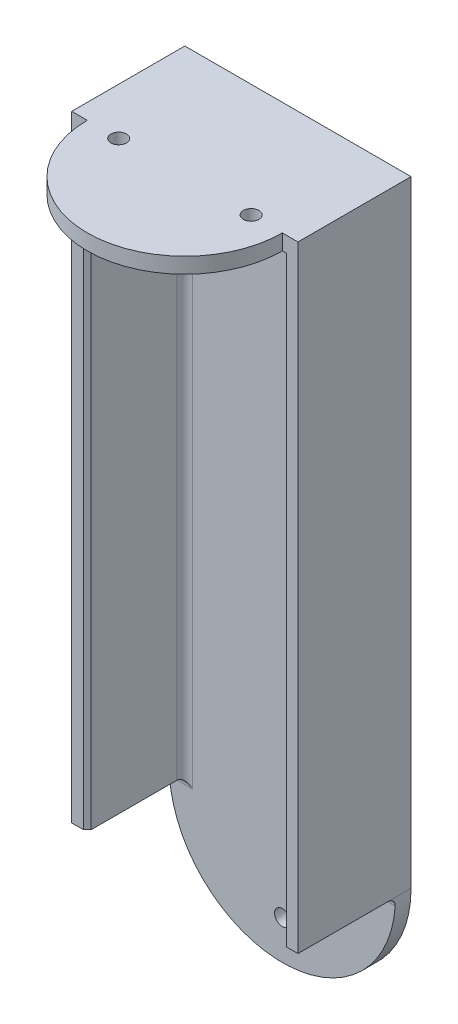
ISO-10303-21;
HEADER;
FILE_DESCRIPTION(('STEP AP214'),'2;1');
FILE_NAME('part.step','',(''),(''),'','','');
FILE_SCHEMA(('AUTOMOTIVE_DESIGN { 1 0 10303 214 1 1 1 1 }'));
ENDSEC;
DATA;
#1=APPLICATION_CONTEXT('core data for automotive mechanical design processes');
#2=APPLICATION_PROTOCOL_DEFINITION('international standard','automotive_design',2000,#1);
#3=PRODUCT_CONTEXT('',#1,'mechanical');
#4=PRODUCT('Part','Part','',(#3));
#5=PRODUCT_RELATED_PRODUCT_CATEGORY('part','',(#4));
#6=PRODUCT_DEFINITION_FORMATION('','',#4);
#7=PRODUCT_DEFINITION_CONTEXT('part definition',#1,'design');
#8=PRODUCT_DEFINITION('design','',#6,#7);
#9=PRODUCT_DEFINITION_SHAPE('','',#8);
#10=(LENGTH_UNIT() NAMED_UNIT(*) SI_UNIT(.MILLI.,.METRE.));
#11=(NAMED_UNIT(*) PLANE_ANGLE_UNIT() SI_UNIT($,.RADIAN.));
#12=(NAMED_UNIT(*) SI_UNIT($,.STERADIAN.) SOLID_ANGLE_UNIT());
#13=UNCERTAINTY_MEASURE_WITH_UNIT(LENGTH_MEASURE(1.E-05),#10,'distance_accuracy_value','');
#14=(GEOMETRIC_REPRESENTATION_CONTEXT(3) GLOBAL_UNCERTAINTY_ASSIGNED_CONTEXT((#13)) GLOBAL_UNIT_ASSIGNED_CONTEXT((#10,
#11,#12)) REPRESENTATION_CONTEXT('',''));
#15=CARTESIAN_POINT('',(0.,0.,0.));
#16=DIRECTION('',(0.,0.,1.));
#17=DIRECTION('',(1.,0.,0.));
#18=AXIS2_PLACEMENT_3D('',#15,#16,#17);
#19=CARTESIAN_POINT('',(0.,-39.5,0.));
#20=DIRECTION('',(0.,0.,1.));
#21=DIRECTION('',(1.,0.,0.));
#22=AXIS2_PLACEMENT_3D('',#19,#20,#21);
#23=PLANE('',#22);
#24=CARTESIAN_POINT('',(0.,-49.,0.));
#25=DIRECTION('',(0.,0.,1.));
#26=DIRECTION('',(1.,0.,0.));
#27=AXIS2_PLACEMENT_3D('',#24,#25,#26);
#28=CIRCLE('',#27,1.);
#29=CARTESIAN_POINT('',(1.,-49.,0.));
#30=VERTEX_POINT('',#29);
#31=EDGE_CURVE('E249',#30,#30,#28,.T.);
#32=ORIENTED_EDGE('',*,*,#31,.F.);
#33=EDGE_LOOP('',(#32));
#34=FACE_BOUND('',#33,.T.);
#35=CARTESIAN_POINT('',(0.,34.5,0.));
#36=DIRECTION('',(0.,0.,1.));
#37=DIRECTION('',(1.,0.,0.));
#38=AXIS2_PLACEMENT_3D('',#35,#36,#37);
#39=CIRCLE('',#38,1.);
#40=CARTESIAN_POINT('',(1.,34.5,0.));
#41=VERTEX_POINT('',#40);
#42=EDGE_CURVE('E263',#41,#41,#39,.T.);
#43=ORIENTED_EDGE('',*,*,#42,.F.);
#44=EDGE_LOOP('',(#43));
#45=FACE_BOUND('',#44,.T.);
#46=CARTESIAN_POINT('',(0.,-39.5,0.));
#47=DIRECTION('',(0.,0.,1.));
#48=DIRECTION('',(1.,0.,0.));
#49=AXIS2_PLACEMENT_3D('',#46,#47,#48);
#50=CIRCLE('',#49,14.5);
#51=CARTESIAN_POINT('',(-14.4654761414894,-40.5,0.));
#52=VERTEX_POINT('',#51);
#53=CARTESIAN_POINT('',(14.4654761414894,-40.5,0.));
#54=VERTEX_POINT('',#53);
#55=EDGE_CURVE('E268',#52,#54,#50,.T.);
#56=ORIENTED_EDGE('',*,*,#55,.T.);
#57=DIRECTION('',(1.,0.,0.));
#58=VECTOR('',#57,1.);
#59=CARTESIAN_POINT('',(12.5,-40.5,0.));
#60=LINE('',#59,#58);
#61=CARTESIAN_POINT('',(11.5,-40.5,0.));
#62=VERTEX_POINT('',#61);
#63=EDGE_CURVE('E146',#54,#62,#60,.F.);
#64=ORIENTED_EDGE('',*,*,#63,.T.);
#65=DIRECTION('',(0.,1.,0.));
#66=VECTOR('',#65,1.);
#67=CARTESIAN_POINT('',(11.5,37.5,0.));
#68=LINE('',#67,#66);
#69=CARTESIAN_POINT('',(11.5,36.5,0.));
#70=VERTEX_POINT('',#69);
#71=EDGE_CURVE('E148',#62,#70,#68,.T.);
#72=ORIENTED_EDGE('',*,*,#71,.T.);
#73=DIRECTION('',(1.,0.,0.));
#74=VECTOR('',#73,1.);
#75=CARTESIAN_POINT('',(0.,36.5,0.));
#76=LINE('',#75,#74);
#77=CARTESIAN_POINT('',(-11.5,36.5,0.));
#78=VERTEX_POINT('',#77);
#79=EDGE_CURVE('E136',#70,#78,#76,.F.);
#80=ORIENTED_EDGE('',*,*,#79,.T.);
#81=DIRECTION('',(0.,-1.,0.));
#82=VECTOR('',#81,1.);
#83=CARTESIAN_POINT('',(-11.5,-39.5,0.));
#84=LINE('',#83,#82);
#85=CARTESIAN_POINT('',(-11.5,-40.5,0.));
#86=VERTEX_POINT('',#85);
#87=EDGE_CURVE('E325',#78,#86,#84,.T.);
#88=ORIENTED_EDGE('',*,*,#87,.T.);
#89=DIRECTION('',(-1.,0.,0.));
#90=VECTOR('',#89,1.);
#91=CARTESIAN_POINT('',(-14.5,-40.5,0.));
#92=LINE('',#91,#90);
#93=EDGE_CURVE('E323',#86,#52,#92,.T.);
#94=ORIENTED_EDGE('',*,*,#93,.T.);
#95=EDGE_LOOP('',(#56,#64,#72,#80,#88,#94));
#96=FACE_BOUND('',#95,.T.);
#97=ADVANCED_FACE('F35',(#34,#45,#96),#23,.T.);
#98=CARTESIAN_POINT('',(-12.5,0.,0.));
#99=DIRECTION('',(-1.,0.,0.));
#100=DIRECTION('',(0.,0.,1.));
#101=AXIS2_PLACEMENT_3D('',#98,#99,#100);
#102=PLANE('',#101);
#103=DIRECTION('',(0.,0.,1.));
#104=VECTOR('',#103,1.);
#105=CARTESIAN_POINT('',(-12.5,-39.5,0.));
#106=LINE('',#105,#104);
#107=CARTESIAN_POINT('',(-12.5,-39.5,1.));
#108=VERTEX_POINT('',#107);
#109=CARTESIAN_POINT('',(-12.5,-39.5,12.));
#110=VERTEX_POINT('',#109);
#111=EDGE_CURVE('E256',#108,#110,#106,.T.);
#112=ORIENTED_EDGE('',*,*,#111,.F.);
#113=DIRECTION('',(0.,-1.,0.));
#114=VECTOR('',#113,1.);
#115=CARTESIAN_POINT('',(-12.5,0.,1.));
#116=LINE('',#115,#114);
#117=CARTESIAN_POINT('',(-12.5,37.5,1.));
#118=VERTEX_POINT('',#117);
#119=EDGE_CURVE('E124',#108,#118,#116,.F.);
#120=ORIENTED_EDGE('',*,*,#119,.T.);
#121=DIRECTION('',(0.,0.,1.));
#122=VECTOR('',#121,1.);
#123=CARTESIAN_POINT('',(-12.5,37.5,0.));
#124=LINE('',#123,#122);
#125=CARTESIAN_POINT('',(-12.5,37.5,12.));
#126=VERTEX_POINT('',#125);
#127=EDGE_CURVE('E119',#118,#126,#124,.T.);
#128=ORIENTED_EDGE('',*,*,#127,.T.);
#129=DIRECTION('',(0.,-1.,0.));
#130=VECTOR('',#129,1.);
#131=CARTESIAN_POINT('',(-12.5,-39.5,12.));
#132=LINE('',#131,#130);
#133=EDGE_CURVE('E310',#126,#110,#132,.T.);
#134=ORIENTED_EDGE('',*,*,#133,.T.);
#135=EDGE_LOOP('',(#112,#120,#128,#134));
#136=FACE_BOUND('',#135,.T.);
#137=ADVANCED_FACE('F202',(#136),#102,.F.);
#138=CARTESIAN_POINT('',(12.5,0.,0.));
#139=DIRECTION('',(-1.,0.,0.));
#140=DIRECTION('',(0.,0.,1.));
#141=AXIS2_PLACEMENT_3D('',#138,#139,#140);
#142=PLANE('',#141);
#143=DIRECTION('',(0.,0.,1.));
#144=VECTOR('',#143,1.);
#145=CARTESIAN_POINT('',(12.5,37.5,0.));
#146=LINE('',#145,#144);
#147=CARTESIAN_POINT('',(12.5,37.5,1.));
#148=VERTEX_POINT('',#147);
#149=CARTESIAN_POINT('',(12.5,37.5,12.));
#150=VERTEX_POINT('',#149);
#151=EDGE_CURVE('E115',#148,#150,#146,.T.);
#152=ORIENTED_EDGE('',*,*,#151,.F.);
#153=DIRECTION('',(0.,1.,0.));
#154=VECTOR('',#153,1.);
#155=CARTESIAN_POINT('',(12.5,-39.5,1.));
#156=LINE('',#155,#154);
#157=CARTESIAN_POINT('',(12.5,-39.5,1.));
#158=VERTEX_POINT('',#157);
#159=EDGE_CURVE('E87',#148,#158,#156,.F.);
#160=ORIENTED_EDGE('',*,*,#159,.T.);
#161=DIRECTION('',(0.,0.,-1.));
#162=VECTOR('',#161,1.);
#163=CARTESIAN_POINT('',(12.5,-39.5,0.));
#164=LINE('',#163,#162);
#165=CARTESIAN_POINT('',(12.5,-39.5,12.));
#166=VERTEX_POINT('',#165);
#167=EDGE_CURVE('E349',#166,#158,#164,.T.);
#168=ORIENTED_EDGE('',*,*,#167,.F.);
#169=DIRECTION('',(0.,1.,0.));
#170=VECTOR('',#169,1.);
#171=CARTESIAN_POINT('',(12.5,0.,12.));
#172=LINE('',#171,#170);
#173=EDGE_CURVE('E128',#166,#150,#172,.T.);
#174=ORIENTED_EDGE('',*,*,#173,.T.);
#175=EDGE_LOOP('',(#152,#160,#168,#174));
#176=FACE_BOUND('',#175,.T.);
#177=ADVANCED_FACE('F126',(#176),#142,.T.);
#178=CARTESIAN_POINT('',(-14.5,-39.5,-2.));
#179=DIRECTION('',(-1.,0.,0.));
#180=DIRECTION('',(0.,0.,1.));
#181=AXIS2_PLACEMENT_3D('',#178,#179,#180);
#182=PLANE('',#181);
#183=DIRECTION('',(0.,0.,1.));
#184=VECTOR('',#183,1.);
#185=CARTESIAN_POINT('',(-14.5,-39.5,-2.));
#186=LINE('',#185,#184);
#187=CARTESIAN_POINT('',(-14.5,-39.5,-2.));
#188=VERTEX_POINT('',#187);
#189=CARTESIAN_POINT('',(-14.5,-39.5,1.));
#190=VERTEX_POINT('',#189);
#191=EDGE_CURVE('E53',#188,#190,#186,.T.);
#192=ORIENTED_EDGE('',*,*,#191,.T.);
#193=DIRECTION('',(0.,0.,1.));
#194=VECTOR('',#193,1.);
#195=CARTESIAN_POINT('',(-14.5,-39.5,0.));
#196=LINE('',#195,#194);
#197=CARTESIAN_POINT('',(-14.5,-39.5,12.5));
#198=VERTEX_POINT('',#197);
#199=EDGE_CURVE('E360',#190,#198,#196,.T.);
#200=ORIENTED_EDGE('',*,*,#199,.T.);
#201=DIRECTION('',(0.,1.,0.));
#202=VECTOR('',#201,1.);
#203=CARTESIAN_POINT('',(-14.5,39.5,12.5));
#204=LINE('',#203,#202);
#205=CARTESIAN_POINT('',(-14.5,39.5,12.5));
#206=VERTEX_POINT('',#205);
#207=EDGE_CURVE('E259',#198,#206,#204,.T.);
#208=ORIENTED_EDGE('',*,*,#207,.T.);
#209=DIRECTION('',(0.,0.,1.));
#210=VECTOR('',#209,1.);
#211=CARTESIAN_POINT('',(-14.5,39.5,-2.));
#212=LINE('',#211,#210);
#213=CARTESIAN_POINT('',(-14.5,39.5,-2.));
#214=VERTEX_POINT('',#213);
#215=EDGE_CURVE('E242',#214,#206,#212,.T.);
#216=ORIENTED_EDGE('',*,*,#215,.F.);
#217=DIRECTION('',(0.,-1.,0.));
#218=VECTOR('',#217,1.);
#219=CARTESIAN_POINT('',(-14.5,-39.5,-2.));
#220=LINE('',#219,#218);
#221=EDGE_CURVE('E271',#214,#188,#220,.T.);
#222=ORIENTED_EDGE('',*,*,#221,.T.);
#223=EDGE_LOOP('',(#192,#200,#208,#216,#222));
#224=FACE_BOUND('',#223,.T.);
#225=ADVANCED_FACE('F177',(#224),#182,.T.);
#226=CARTESIAN_POINT('',(14.5,39.5,-2.));
#227=DIRECTION('',(0.,1.,0.));
#228=DIRECTION('',(0.,0.,1.));
#229=AXIS2_PLACEMENT_3D('',#226,#227,#228);
#230=PLANE('',#229);
#231=CARTESIAN_POINT('',(-8.47445336325647,39.5,12.5000000000001));
#232=DIRECTION('',(0.,1.,0.));
#233=DIRECTION('',(0.,0.,1.));
#234=AXIS2_PLACEMENT_3D('',#231,#232,#233);
#235=CIRCLE('',#234,1.);
#236=CARTESIAN_POINT('',(-8.47445336325647,39.5,13.5000000000001));
#237=VERTEX_POINT('',#236);
#238=EDGE_CURVE('E223',#237,#237,#235,.T.);
#239=ORIENTED_EDGE('',*,*,#238,.F.);
#240=EDGE_LOOP('',(#239));
#241=FACE_BOUND('',#240,.T.);
#242=CARTESIAN_POINT('',(8.5,39.5,12.5));
#243=DIRECTION('',(0.,1.,0.));
#244=DIRECTION('',(0.,0.,1.));
#245=AXIS2_PLACEMENT_3D('',#242,#243,#244);
#246=CIRCLE('',#245,0.999999999999999);
#247=CARTESIAN_POINT('',(8.5,39.5,13.5));
#248=VERTEX_POINT('',#247);
#249=EDGE_CURVE('E227',#248,#248,#246,.T.);
#250=ORIENTED_EDGE('',*,*,#249,.F.);
#251=EDGE_LOOP('',(#250));
#252=FACE_BOUND('',#251,.T.);
#253=DIRECTION('',(-1.,0.,0.));
#254=VECTOR('',#253,1.);
#255=CARTESIAN_POINT('',(-12.5,39.5,12.5));
#256=LINE('',#255,#254);
#257=CARTESIAN_POINT('',(-12.5,39.5,12.5));
#258=VERTEX_POINT('',#257);
#259=EDGE_CURVE('E233',#258,#206,#256,.T.);
#260=ORIENTED_EDGE('',*,*,#259,.F.);
#261=CARTESIAN_POINT('',(0.,39.5,12.5));
#262=DIRECTION('',(0.,1.,0.));
#263=DIRECTION('',(0.,0.,1.));
#264=AXIS2_PLACEMENT_3D('',#261,#262,#263);
#265=CIRCLE('',#264,12.5);
#266=CARTESIAN_POINT('',(12.5,39.5,12.5));
#267=VERTEX_POINT('',#266);
#268=EDGE_CURVE('E237',#258,#267,#265,.T.);
#269=ORIENTED_EDGE('',*,*,#268,.T.);
#270=DIRECTION('',(1.,0.,0.));
#271=VECTOR('',#270,1.);
#272=CARTESIAN_POINT('',(12.5,39.5,12.5));
#273=LINE('',#272,#271);
#274=CARTESIAN_POINT('',(14.5,39.5,12.5));
#275=VERTEX_POINT('',#274);
#276=EDGE_CURVE('E352',#267,#275,#273,.T.);
#277=ORIENTED_EDGE('',*,*,#276,.T.);
#278=DIRECTION('',(0.,0.,1.));
#279=VECTOR('',#278,1.);
#280=CARTESIAN_POINT('',(14.5,39.5,-2.));
#281=LINE('',#280,#279);
#282=CARTESIAN_POINT('',(14.5,39.5,-2.));
#283=VERTEX_POINT('',#282);
#284=EDGE_CURVE('E284',#283,#275,#281,.T.);
#285=ORIENTED_EDGE('',*,*,#284,.F.);
#286=DIRECTION('',(-1.,0.,0.));
#287=VECTOR('',#286,1.);
#288=CARTESIAN_POINT('',(14.5,39.5,-2.));
#289=LINE('',#288,#287);
#290=EDGE_CURVE('E278',#283,#214,#289,.T.);
#291=ORIENTED_EDGE('',*,*,#290,.T.);
#292=ORIENTED_EDGE('',*,*,#215,.T.);
#293=EDGE_LOOP('',(#260,#269,#277,#285,#291,#292));
#294=FACE_BOUND('',#293,.T.);
#295=ADVANCED_FACE('F181',(#241,#252,#294),#230,.T.);
#296=CARTESIAN_POINT('',(14.5,-39.5,-2.));
#297=DIRECTION('',(1.,0.,0.));
#298=DIRECTION('',(0.,0.,-1.));
#299=AXIS2_PLACEMENT_3D('',#296,#297,#298);
#300=PLANE('',#299);
#301=ORIENTED_EDGE('',*,*,#284,.T.);
#302=DIRECTION('',(0.,-1.,0.));
#303=VECTOR('',#302,1.);
#304=CARTESIAN_POINT('',(14.5,39.5,12.5));
#305=LINE('',#304,#303);
#306=CARTESIAN_POINT('',(14.5,-39.5,12.5));
#307=VERTEX_POINT('',#306);
#308=EDGE_CURVE('E345',#275,#307,#305,.T.);
#309=ORIENTED_EDGE('',*,*,#308,.T.);
#310=DIRECTION('',(0.,0.,-1.));
#311=VECTOR('',#310,1.);
#312=CARTESIAN_POINT('',(14.5,-39.5,0.));
#313=LINE('',#312,#311);
#314=CARTESIAN_POINT('',(14.5,-39.5,1.));
#315=VERTEX_POINT('',#314);
#316=EDGE_CURVE('E350',#307,#315,#313,.T.);
#317=ORIENTED_EDGE('',*,*,#316,.T.);
#318=DIRECTION('',(0.,0.,1.));
#319=VECTOR('',#318,1.);
#320=CARTESIAN_POINT('',(14.5,-39.5,-2.));
#321=LINE('',#320,#319);
#322=CARTESIAN_POINT('',(14.5,-39.5,-2.));
#323=VERTEX_POINT('',#322);
#324=EDGE_CURVE('E75',#323,#315,#321,.T.);
#325=ORIENTED_EDGE('',*,*,#324,.F.);
#326=DIRECTION('',(0.,1.,0.));
#327=VECTOR('',#326,1.);
#328=CARTESIAN_POINT('',(14.5,-39.5,-2.));
#329=LINE('',#328,#327);
#330=EDGE_CURVE('E275',#323,#283,#329,.T.);
#331=ORIENTED_EDGE('',*,*,#330,.T.);
#332=EDGE_LOOP('',(#301,#309,#317,#325,#331));
#333=FACE_BOUND('',#332,.T.);
#334=ADVANCED_FACE('F175',(#333),#300,.T.);
#335=CARTESIAN_POINT('',(0.,-39.5,-2.));
#336=DIRECTION('',(0.,0.,1.));
#337=DIRECTION('',(1.,0.,0.));
#338=AXIS2_PLACEMENT_3D('',#335,#336,#337);
#339=CYLINDRICAL_SURFACE('',#338,14.5);
#340=ORIENTED_EDGE('',*,*,#55,.F.);
#341=CARTESIAN_POINT('',(-14.4654761414894,-40.5,0.));
#342=CARTESIAN_POINT('',(-14.4674164791853,-40.4719386796734,1.84003181222671E-07));
#343=CARTESIAN_POINT('',(-14.4692732370801,-40.4438848824766,0.00118191398940414));
#344=CARTESIAN_POINT('',(-14.4728124350816,-40.3879658061393,0.00589916918851215));
#345=CARTESIAN_POINT('',(-14.474494880839,-40.3601005209152,0.00943461807218605));
#346=CARTESIAN_POINT('',(-14.4792650427977,-40.2771344850049,0.023542478609587));
#347=CARTESIAN_POINT('',(-14.4820819080417,-40.2225716264139,0.0376164769448302));
#348=CARTESIAN_POINT('',(-14.4869836822029,-40.1165470533677,0.0747299832331384));
#349=CARTESIAN_POINT('',(-14.4890681833228,-40.0650870798388,0.0977744711574841));
#350=CARTESIAN_POINT('',(-14.4925693519238,-39.966749048083,0.152180181513734));
#351=CARTESIAN_POINT('',(-14.4939861530983,-39.9198700740952,0.183539737055564));
#352=CARTESIAN_POINT('',(-14.4962631922019,-39.8320892923725,0.253644029411876));
#353=CARTESIAN_POINT('',(-14.4971241261777,-39.7911800593403,0.292379451247894));
#354=CARTESIAN_POINT('',(-14.4984331089142,-39.7164227662041,0.376173714087721));
#355=CARTESIAN_POINT('',(-14.4988810730216,-39.6825761549423,0.421233849392498));
#356=CARTESIAN_POINT('',(-14.4995100373056,-39.6228956409267,0.516422435475909));
#357=CARTESIAN_POINT('',(-14.499690840859,-39.5970676507045,0.566554590167599));
#358=CARTESIAN_POINT('',(-14.4999146401083,-39.5542003162398,0.670431730824274));
#359=CARTESIAN_POINT('',(-14.4999577149848,-39.5371559270248,0.724174622819376));
#360=CARTESIAN_POINT('',(-14.4999929166407,-39.5165196051831,0.815197776418919));
#361=CARTESIAN_POINT('',(-14.4999973347025,-39.51032868207,0.851909989001435));
#362=CARTESIAN_POINT('',(-14.5000000170038,-39.5020692902672,0.925743036296814));
#363=CARTESIAN_POINT('',(-14.499998289855,-39.4999950589587,0.962863226569514));
#364=CARTESIAN_POINT('',(-14.5,-39.5,1.));
#365=B_SPLINE_CURVE_WITH_KNOTS('',3,(#341,#342,#343,#344,#345,#346,#347,#348,#349,#350,#351,
#352,#353,#354,#355,#356,#357,#358,#359,#360,#361,#362,#363,#364),.UNSPECIFIED.,.F.,.F.,(4,2,2,
2,2,2,2,2,2,2,2,4),(0.,0.0843335524691576,0.168664370202231,0.337053083432004,0.505535411354778,
0.673983989766038,0.84222122876691,1.0104929464768,1.17888844629415,1.34718711792118,
1.45866345890462,1.56998364293882),.UNSPECIFIED.);
#366=EDGE_CURVE('E11',#52,#190,#365,.T.);
#367=ORIENTED_EDGE('',*,*,#366,.T.);
#368=ORIENTED_EDGE('',*,*,#191,.F.);
#369=CARTESIAN_POINT('',(0.,-39.5,-2.));
#370=DIRECTION('',(0.,0.,1.));
#371=DIRECTION('',(1.,0.,0.));
#372=AXIS2_PLACEMENT_3D('',#369,#370,#371);
#373=CIRCLE('',#372,14.5);
#374=EDGE_CURVE('E273',#188,#323,#373,.T.);
#375=ORIENTED_EDGE('',*,*,#374,.T.);
#376=ORIENTED_EDGE('',*,*,#324,.T.);
#377=CARTESIAN_POINT('',(14.5,-39.5,1.));
#378=CARTESIAN_POINT('',(14.4999995283151,-39.5000001872904,0.971866571564379));
#379=CARTESIAN_POINT('',(14.5000000530088,-39.5011879795094,0.943746620853791));
#380=CARTESIAN_POINT('',(14.4999990743133,-39.5059265678941,0.887707917176574));
#381=CARTESIAN_POINT('',(14.4999975710211,-39.5094772511853,0.859789154663642));
#382=CARTESIAN_POINT('',(14.4999840037029,-39.5236399910151,0.776682961505174));
#383=CARTESIAN_POINT('',(14.4999629070439,-39.5377628305202,0.722052165421193));
#384=CARTESIAN_POINT('',(14.4998179417489,-39.5749789894795,0.615938342946781));
#385=CARTESIAN_POINT('',(14.499694023477,-39.5980766385385,0.564456849730269));
#386=CARTESIAN_POINT('',(14.4992226683436,-39.6525840126122,0.466104218025147));
#387=CARTESIAN_POINT('',(14.4988752706745,-39.6839922795951,0.419232272804681));
#388=CARTESIAN_POINT('',(14.4978136666883,-39.754220763836,0.331439306768043));
#389=CARTESIAN_POINT('',(14.4970995369515,-39.7930394326041,0.290517045837405));
#390=CARTESIAN_POINT('',(14.495158963071,-39.876995690902,0.21576496634361));
#391=CARTESIAN_POINT('',(14.4939324290019,-39.922134388653,0.181936394267359));
#392=CARTESIAN_POINT('',(14.4908442845553,-40.0173968076933,0.122361416057955));
#393=CARTESIAN_POINT('',(14.4889830845207,-40.0675172932142,0.0966098083720392));
#394=CARTESIAN_POINT('',(14.484543777681,-40.1713294213062,0.0538914270383299));
#395=CARTESIAN_POINT('',(14.4819660683055,-40.2250190716277,0.0369197982483215));
#396=CARTESIAN_POINT('',(14.4770745305932,-40.3158600117236,0.0163995899088281));
#397=CARTESIAN_POINT('',(14.4749668028222,-40.3524567922007,0.0102518713847202));
#398=CARTESIAN_POINT('',(14.4704468194944,-40.4260341964225,0.00205253938310625));
#399=CARTESIAN_POINT('',(14.4680350067807,-40.4630141916209,-4.95911299779774E-06));
#400=CARTESIAN_POINT('',(14.4654761414894,-40.5,0.));
#401=B_SPLINE_CURVE_WITH_KNOTS('',3,(#377,#378,#379,#380,#381,#382,#383,#384,#385,#386,#387,
#388,#389,#390,#391,#392,#393,#394,#395,#396,#397,#398,#399,#400),.UNSPECIFIED.,.F.,.F.,(4,2,2,
2,2,2,2,2,2,2,2,4),(0.,0.0843484473991786,0.168692865788987,0.337104891443355,0.505598263073496,
0.674062093460334,0.842490759819773,1.0109489973276,1.1792985241724,1.3475548575206,
1.45884908937221,1.56998307457883),.UNSPECIFIED.);
#402=EDGE_CURVE('E45',#315,#54,#401,.T.);
#403=ORIENTED_EDGE('',*,*,#402,.T.);
#404=EDGE_LOOP('',(#340,#367,#368,#375,#376,#403));
#405=FACE_BOUND('',#404,.T.);
#406=ADVANCED_FACE('F169',(#405),#339,.T.);
#407=CARTESIAN_POINT('',(0.,-39.5,-2.));
#408=DIRECTION('',(0.,0.,1.));
#409=DIRECTION('',(1.,0.,0.));
#410=AXIS2_PLACEMENT_3D('',#407,#408,#409);
#411=PLANE('',#410);
#412=CARTESIAN_POINT('',(0.,-49.,-2.));
#413=DIRECTION('',(0.,0.,1.));
#414=DIRECTION('',(1.,0.,0.));
#415=AXIS2_PLACEMENT_3D('',#412,#413,#414);
#416=CIRCLE('',#415,1.);
#417=CARTESIAN_POINT('',(1.,-49.,-2.));
#418=VERTEX_POINT('',#417);
#419=EDGE_CURVE('E253',#418,#418,#416,.T.);
#420=ORIENTED_EDGE('',*,*,#419,.T.);
#421=EDGE_LOOP('',(#420));
#422=FACE_BOUND('',#421,.T.);
#423=CARTESIAN_POINT('',(0.,34.5,-2.));
#424=DIRECTION('',(0.,0.,1.));
#425=DIRECTION('',(1.,0.,0.));
#426=AXIS2_PLACEMENT_3D('',#423,#424,#425);
#427=CIRCLE('',#426,1.);
#428=CARTESIAN_POINT('',(1.,34.5,-2.));
#429=VERTEX_POINT('',#428);
#430=EDGE_CURVE('E265',#429,#429,#427,.T.);
#431=ORIENTED_EDGE('',*,*,#430,.T.);
#432=EDGE_LOOP('',(#431));
#433=FACE_BOUND('',#432,.T.);
#434=ORIENTED_EDGE('',*,*,#221,.F.);
#435=ORIENTED_EDGE('',*,*,#290,.F.);
#436=ORIENTED_EDGE('',*,*,#330,.F.);
#437=ORIENTED_EDGE('',*,*,#374,.F.);
#438=EDGE_LOOP('',(#434,#435,#436,#437));
#439=FACE_BOUND('',#438,.T.);
#440=ADVANCED_FACE('F174',(#422,#433,#439),#411,.F.);
#441=CARTESIAN_POINT('',(0.,34.5,-2.));
#442=DIRECTION('',(0.,0.,1.));
#443=DIRECTION('',(1.,0.,0.));
#444=AXIS2_PLACEMENT_3D('',#441,#442,#443);
#445=CYLINDRICAL_SURFACE('',#444,1.);
#446=ORIENTED_EDGE('',*,*,#430,.F.);
#447=EDGE_LOOP('',(#446));
#448=FACE_BOUND('',#447,.T.);
#449=ORIENTED_EDGE('',*,*,#42,.T.);
#450=EDGE_LOOP('',(#449));
#451=FACE_BOUND('',#450,.T.);
#452=ADVANCED_FACE('F430',(#448,#451),#445,.F.);
#453=CARTESIAN_POINT('',(0.,-49.,-2.));
#454=DIRECTION('',(0.,0.,1.));
#455=DIRECTION('',(1.,0.,0.));
#456=AXIS2_PLACEMENT_3D('',#453,#454,#455);
#457=CYLINDRICAL_SURFACE('',#456,1.);
#458=ORIENTED_EDGE('',*,*,#419,.F.);
#459=EDGE_LOOP('',(#458));
#460=FACE_BOUND('',#459,.T.);
#461=ORIENTED_EDGE('',*,*,#31,.T.);
#462=EDGE_LOOP('',(#461));
#463=FACE_BOUND('',#462,.T.);
#464=ADVANCED_FACE('F427',(#460,#463),#457,.F.);
#465=CARTESIAN_POINT('',(-12.5,39.5,12.5));
#466=DIRECTION('',(0.,0.,1.));
#467=DIRECTION('',(0.,-1.,0.));
#468=AXIS2_PLACEMENT_3D('',#465,#466,#467);
#469=PLANE('',#468);
#470=DIRECTION('',(-1.,0.,0.));
#471=VECTOR('',#470,1.);
#472=CARTESIAN_POINT('',(-12.5,-39.5,12.5));
#473=LINE('',#472,#471);
#474=CARTESIAN_POINT('',(-13.,-39.5,12.5));
#475=VERTEX_POINT('',#474);
#476=EDGE_CURVE('E250',#475,#198,#473,.T.);
#477=ORIENTED_EDGE('',*,*,#476,.F.);
#478=DIRECTION('',(0.,1.,0.));
#479=VECTOR('',#478,1.);
#480=CARTESIAN_POINT('',(-13.,37.5,12.5));
#481=LINE('',#480,#479);
#482=CARTESIAN_POINT('',(-13.,37.5,12.5));
#483=VERTEX_POINT('',#482);
#484=EDGE_CURVE('E307',#475,#483,#481,.T.);
#485=ORIENTED_EDGE('',*,*,#484,.T.);
#486=DIRECTION('',(1.,0.,0.));
#487=VECTOR('',#486,1.);
#488=CARTESIAN_POINT('',(0.,37.5,12.5));
#489=LINE('',#488,#487);
#490=CARTESIAN_POINT('',(-12.5,37.5,12.5));
#491=VERTEX_POINT('',#490);
#492=EDGE_CURVE('E304',#483,#491,#489,.T.);
#493=ORIENTED_EDGE('',*,*,#492,.T.);
#494=DIRECTION('',(0.,1.,0.));
#495=VECTOR('',#494,1.);
#496=CARTESIAN_POINT('',(-12.5,37.5,12.5));
#497=LINE('',#496,#495);
#498=EDGE_CURVE('E342',#491,#258,#497,.T.);
#499=ORIENTED_EDGE('',*,*,#498,.T.);
#500=ORIENTED_EDGE('',*,*,#259,.T.);
#501=ORIENTED_EDGE('',*,*,#207,.F.);
#502=EDGE_LOOP('',(#477,#485,#493,#499,#500,#501));
#503=FACE_BOUND('',#502,.T.);
#504=ADVANCED_FACE('F368',(#503),#469,.T.);
#505=CARTESIAN_POINT('',(-12.5,-39.5,0.));
#506=DIRECTION('',(0.,-1.,0.));
#507=DIRECTION('',(0.,0.,-1.));
#508=AXIS2_PLACEMENT_3D('',#505,#506,#507);
#509=PLANE('',#508);
#510=ORIENTED_EDGE('',*,*,#199,.F.);
#511=DIRECTION('',(-1.,0.,0.));
#512=VECTOR('',#511,1.);
#513=CARTESIAN_POINT('',(-12.5,-39.5,1.));
#514=LINE('',#513,#512);
#515=EDGE_CURVE('E61',#190,#108,#514,.F.);
#516=ORIENTED_EDGE('',*,*,#515,.T.);
#517=ORIENTED_EDGE('',*,*,#111,.T.);
#518=DIRECTION('',(-0.707106781186548,0.,0.707106781186547));
#519=VECTOR('',#518,1.);
#520=CARTESIAN_POINT('',(-6.49999999999998,-39.5,6.00000000000002));
#521=LINE('',#520,#519);
#522=EDGE_CURVE('E313',#110,#475,#521,.T.);
#523=ORIENTED_EDGE('',*,*,#522,.T.);
#524=ORIENTED_EDGE('',*,*,#476,.T.);
#525=EDGE_LOOP('',(#510,#516,#517,#523,#524));
#526=FACE_BOUND('',#525,.T.);
#527=ADVANCED_FACE('F397',(#526),#509,.T.);
#528=CARTESIAN_POINT('',(12.5,-39.5,0.));
#529=DIRECTION('',(0.,-1.,0.));
#530=DIRECTION('',(0.,0.,-1.));
#531=AXIS2_PLACEMENT_3D('',#528,#529,#530);
#532=PLANE('',#531);
#533=ORIENTED_EDGE('',*,*,#167,.T.);
#534=DIRECTION('',(1.,0.,0.));
#535=VECTOR('',#534,1.);
#536=CARTESIAN_POINT('',(14.5,-39.5,1.));
#537=LINE('',#536,#535);
#538=EDGE_CURVE('E320',#158,#315,#537,.T.);
#539=ORIENTED_EDGE('',*,*,#538,.T.);
#540=ORIENTED_EDGE('',*,*,#316,.F.);
#541=DIRECTION('',(1.,0.,0.));
#542=VECTOR('',#541,1.);
#543=CARTESIAN_POINT('',(12.5,-39.5,12.5));
#544=LINE('',#543,#542);
#545=CARTESIAN_POINT('',(13.,-39.5,12.5));
#546=VERTEX_POINT('',#545);
#547=EDGE_CURVE('E357',#546,#307,#544,.T.);
#548=ORIENTED_EDGE('',*,*,#547,.F.);
#549=DIRECTION('',(0.707106781186547,0.,0.707106781186548));
#550=VECTOR('',#549,1.);
#551=CARTESIAN_POINT('',(6.5,-39.5,6.));
#552=LINE('',#551,#550);
#553=EDGE_CURVE('E300',#546,#166,#552,.F.);
#554=ORIENTED_EDGE('',*,*,#553,.T.);
#555=EDGE_LOOP('',(#533,#539,#540,#548,#554));
#556=FACE_BOUND('',#555,.T.);
#557=ADVANCED_FACE('F414',(#556),#532,.T.);
#558=CARTESIAN_POINT('',(12.5,39.5,12.5));
#559=DIRECTION('',(0.,0.,1.));
#560=DIRECTION('',(0.,-1.,0.));
#561=AXIS2_PLACEMENT_3D('',#558,#559,#560);
#562=PLANE('',#561);
#563=DIRECTION('',(1.,0.,0.));
#564=VECTOR('',#563,1.);
#565=CARTESIAN_POINT('',(0.,37.5,12.5));
#566=LINE('',#565,#564);
#567=CARTESIAN_POINT('',(12.5,37.5,12.5));
#568=VERTEX_POINT('',#567);
#569=CARTESIAN_POINT('',(13.,37.5,12.5));
#570=VERTEX_POINT('',#569);
#571=EDGE_CURVE('E283',#568,#570,#566,.T.);
#572=ORIENTED_EDGE('',*,*,#571,.T.);
#573=DIRECTION('',(0.,-1.,0.));
#574=VECTOR('',#573,1.);
#575=CARTESIAN_POINT('',(13.,39.5,12.5));
#576=LINE('',#575,#574);
#577=EDGE_CURVE('E297',#570,#546,#576,.T.);
#578=ORIENTED_EDGE('',*,*,#577,.T.);
#579=ORIENTED_EDGE('',*,*,#547,.T.);
#580=ORIENTED_EDGE('',*,*,#308,.F.);
#581=ORIENTED_EDGE('',*,*,#276,.F.);
#582=DIRECTION('',(0.,-1.,0.));
#583=VECTOR('',#582,1.);
#584=CARTESIAN_POINT('',(12.5,39.5,12.5));
#585=LINE('',#584,#583);
#586=EDGE_CURVE('E346',#267,#568,#585,.T.);
#587=ORIENTED_EDGE('',*,*,#586,.T.);
#588=EDGE_LOOP('',(#572,#578,#579,#580,#581,#587));
#589=FACE_BOUND('',#588,.T.);
#590=ADVANCED_FACE('F409',(#589),#562,.T.);
#591=CARTESIAN_POINT('',(0.,37.5,12.5));
#592=DIRECTION('',(0.,1.,0.));
#593=DIRECTION('',(0.,0.,1.));
#594=AXIS2_PLACEMENT_3D('',#591,#592,#593);
#595=CYLINDRICAL_SURFACE('',#594,12.5);
#596=ORIENTED_EDGE('',*,*,#268,.F.);
#597=ORIENTED_EDGE('',*,*,#498,.F.);
#598=CARTESIAN_POINT('',(0.,37.5,12.5));
#599=DIRECTION('',(0.,1.,0.));
#600=DIRECTION('',(0.,0.,1.));
#601=AXIS2_PLACEMENT_3D('',#598,#599,#600);
#602=CIRCLE('',#601,12.5);
#603=EDGE_CURVE('E130',#491,#568,#602,.T.);
#604=ORIENTED_EDGE('',*,*,#603,.T.);
#605=ORIENTED_EDGE('',*,*,#586,.F.);
#606=EDGE_LOOP('',(#596,#597,#604,#605));
#607=FACE_BOUND('',#606,.T.);
#608=ADVANCED_FACE('F405',(#607),#595,.T.);
#609=CARTESIAN_POINT('',(0.,37.5,12.5));
#610=DIRECTION('',(0.,1.,0.));
#611=DIRECTION('',(0.,0.,1.));
#612=AXIS2_PLACEMENT_3D('',#609,#610,#611);
#613=PLANE('',#612);
#614=CARTESIAN_POINT('',(-8.47445336325647,37.5,12.5000000000001));
#615=DIRECTION('',(0.,1.,0.));
#616=DIRECTION('',(0.,0.,1.));
#617=AXIS2_PLACEMENT_3D('',#614,#615,#616);
#618=CIRCLE('',#617,1.);
#619=CARTESIAN_POINT('',(-8.47445336325647,37.5,13.5000000000001));
#620=VERTEX_POINT('',#619);
#621=EDGE_CURVE('E292',#620,#620,#618,.T.);
#622=ORIENTED_EDGE('',*,*,#621,.T.);
#623=EDGE_LOOP('',(#622));
#624=FACE_BOUND('',#623,.T.);
#625=CARTESIAN_POINT('',(8.5,37.5,12.5));
#626=DIRECTION('',(0.,1.,0.));
#627=DIRECTION('',(0.,0.,1.));
#628=AXIS2_PLACEMENT_3D('',#625,#626,#627);
#629=CIRCLE('',#628,0.999999999999999);
#630=CARTESIAN_POINT('',(8.5,37.5,13.5));
#631=VERTEX_POINT('',#630);
#632=EDGE_CURVE('E289',#631,#631,#629,.T.);
#633=ORIENTED_EDGE('',*,*,#632,.T.);
#634=EDGE_LOOP('',(#633));
#635=FACE_BOUND('',#634,.T.);
#636=ORIENTED_EDGE('',*,*,#127,.F.);
#637=DIRECTION('',(1.,0.,0.));
#638=VECTOR('',#637,1.);
#639=CARTESIAN_POINT('',(0.,37.5,1.));
#640=LINE('',#639,#638);
#641=EDGE_CURVE('E111',#118,#148,#640,.T.);
#642=ORIENTED_EDGE('',*,*,#641,.T.);
#643=ORIENTED_EDGE('',*,*,#151,.T.);
#644=DIRECTION('',(-0.707106781186547,0.,-0.707106781186548));
#645=VECTOR('',#644,1.);
#646=CARTESIAN_POINT('',(6.50000000000001,37.5,6.00000000000002));
#647=LINE('',#646,#645);
#648=EDGE_CURVE('E316',#150,#570,#647,.F.);
#649=ORIENTED_EDGE('',*,*,#648,.T.);
#650=ORIENTED_EDGE('',*,*,#571,.F.);
#651=ORIENTED_EDGE('',*,*,#603,.F.);
#652=ORIENTED_EDGE('',*,*,#492,.F.);
#653=DIRECTION('',(0.707106781186548,0.,-0.707106781186547));
#654=VECTOR('',#653,1.);
#655=CARTESIAN_POINT('',(-6.49999999999999,37.5,6.00000000000002));
#656=LINE('',#655,#654);
#657=EDGE_CURVE('E318',#483,#126,#656,.T.);
#658=ORIENTED_EDGE('',*,*,#657,.T.);
#659=EDGE_LOOP('',(#636,#642,#643,#649,#650,#651,#652,#658));
#660=FACE_BOUND('',#659,.T.);
#661=ADVANCED_FACE('F112',(#624,#635,#660),#613,.F.);
#662=CARTESIAN_POINT('',(8.5,-54.,12.5));
#663=DIRECTION('',(0.,1.,0.));
#664=DIRECTION('',(0.,0.,1.));
#665=AXIS2_PLACEMENT_3D('',#662,#663,#664);
#666=CYLINDRICAL_SURFACE('',#665,0.999999999999999);
#667=ORIENTED_EDGE('',*,*,#249,.T.);
#668=EDGE_LOOP('',(#667));
#669=FACE_BOUND('',#668,.T.);
#670=ORIENTED_EDGE('',*,*,#632,.F.);
#671=EDGE_LOOP('',(#670));
#672=FACE_BOUND('',#671,.T.);
#673=ADVANCED_FACE('F489',(#669,#672),#666,.F.);
#674=CARTESIAN_POINT('',(-8.47445336325647,-54.,12.5000000000001));
#675=DIRECTION('',(0.,1.,0.));
#676=DIRECTION('',(0.,0.,1.));
#677=AXIS2_PLACEMENT_3D('',#674,#675,#676);
#678=CYLINDRICAL_SURFACE('',#677,1.);
#679=ORIENTED_EDGE('',*,*,#238,.T.);
#680=EDGE_LOOP('',(#679));
#681=FACE_BOUND('',#680,.T.);
#682=ORIENTED_EDGE('',*,*,#621,.F.);
#683=EDGE_LOOP('',(#682));
#684=FACE_BOUND('',#683,.T.);
#685=ADVANCED_FACE('F189',(#681,#684),#678,.F.);
#686=CARTESIAN_POINT('',(13.,39.5,12.5));
#687=DIRECTION('',(0.707106781186548,0.,-0.707106781186547));
#688=DIRECTION('',(0.,-1.,0.));
#689=AXIS2_PLACEMENT_3D('',#686,#687,#688);
#690=PLANE('',#689);
#691=ORIENTED_EDGE('',*,*,#648,.F.);
#692=ORIENTED_EDGE('',*,*,#173,.F.);
#693=ORIENTED_EDGE('',*,*,#553,.F.);
#694=ORIENTED_EDGE('',*,*,#577,.F.);
#695=EDGE_LOOP('',(#691,#692,#693,#694));
#696=FACE_BOUND('',#695,.T.);
#697=ADVANCED_FACE('F183',(#696),#690,.F.);
#698=CARTESIAN_POINT('',(-13.,39.5,12.5));
#699=DIRECTION('',(0.707106781186547,0.,0.707106781186548));
#700=DIRECTION('',(0.,-1.,0.));
#701=AXIS2_PLACEMENT_3D('',#698,#699,#700);
#702=PLANE('',#701);
#703=ORIENTED_EDGE('',*,*,#522,.F.);
#704=ORIENTED_EDGE('',*,*,#133,.F.);
#705=ORIENTED_EDGE('',*,*,#657,.F.);
#706=ORIENTED_EDGE('',*,*,#484,.F.);
#707=EDGE_LOOP('',(#703,#704,#705,#706));
#708=FACE_BOUND('',#707,.T.);
#709=ADVANCED_FACE('F188',(#708),#702,.T.);
#710=CARTESIAN_POINT('',(0.,-40.5,1.));
#711=DIRECTION('',(1.,0.,0.));
#712=DIRECTION('',(0.,0.,-1.));
#713=AXIS2_PLACEMENT_3D('',#710,#711,#712);
#714=CYLINDRICAL_SURFACE('',#713,1.);
#715=ORIENTED_EDGE('',*,*,#366,.F.);
#716=ORIENTED_EDGE('',*,*,#93,.F.);
#717=CARTESIAN_POINT('',(-11.5,-40.5,1.));
#718=DIRECTION('',(0.707106781186547,0.707106781186547,0.));
#719=DIRECTION('',(0.707106781186547,-0.707106781186547,0.));
#720=AXIS2_PLACEMENT_3D('',#717,#718,#719);
#721=ELLIPSE('',#720,1.41421356237309,1.);
#722=EDGE_CURVE('E40',#108,#86,#721,.F.);
#723=ORIENTED_EDGE('',*,*,#722,.F.);
#724=ORIENTED_EDGE('',*,*,#515,.F.);
#725=EDGE_LOOP('',(#715,#716,#723,#724));
#726=FACE_BOUND('',#725,.T.);
#727=ADVANCED_FACE('F37',(#726),#714,.F.);
#728=CARTESIAN_POINT('',(-11.5,-39.5,1.));
#729=DIRECTION('',(0.,-1.,0.));
#730=DIRECTION('',(0.,0.,-1.));
#731=AXIS2_PLACEMENT_3D('',#728,#729,#730);
#732=CYLINDRICAL_SURFACE('',#731,1.);
#733=ORIENTED_EDGE('',*,*,#722,.T.);
#734=ORIENTED_EDGE('',*,*,#87,.F.);
#735=CARTESIAN_POINT('',(-11.5,36.5,1.));
#736=DIRECTION('',(0.707106781186547,0.707106781186547,0.));
#737=DIRECTION('',(0.707106781186547,-0.707106781186547,0.));
#738=AXIS2_PLACEMENT_3D('',#735,#736,#737);
#739=ELLIPSE('',#738,1.41421356237309,1.);
#740=EDGE_CURVE('E139',#118,#78,#739,.F.);
#741=ORIENTED_EDGE('',*,*,#740,.F.);
#742=ORIENTED_EDGE('',*,*,#119,.F.);
#743=EDGE_LOOP('',(#733,#734,#741,#742));
#744=FACE_BOUND('',#743,.T.);
#745=ADVANCED_FACE('F198',(#744),#732,.F.);
#746=CARTESIAN_POINT('',(0.,36.5,1.));
#747=DIRECTION('',(1.,0.,0.));
#748=DIRECTION('',(0.,0.,-1.));
#749=AXIS2_PLACEMENT_3D('',#746,#747,#748);
#750=CYLINDRICAL_SURFACE('',#749,1.);
#751=ORIENTED_EDGE('',*,*,#740,.T.);
#752=ORIENTED_EDGE('',*,*,#79,.F.);
#753=CARTESIAN_POINT('',(11.5,36.5,1.));
#754=DIRECTION('',(0.707106781186547,-0.707106781186547,0.));
#755=DIRECTION('',(-0.707106781186547,-0.707106781186547,0.));
#756=AXIS2_PLACEMENT_3D('',#753,#754,#755);
#757=ELLIPSE('',#756,1.41421356237309,1.);
#758=EDGE_CURVE('E134',#148,#70,#757,.F.);
#759=ORIENTED_EDGE('',*,*,#758,.F.);
#760=ORIENTED_EDGE('',*,*,#641,.F.);
#761=EDGE_LOOP('',(#751,#752,#759,#760));
#762=FACE_BOUND('',#761,.T.);
#763=ADVANCED_FACE('F135',(#762),#750,.F.);
#764=CARTESIAN_POINT('',(11.5,-39.5,1.));
#765=DIRECTION('',(0.,-1.,0.));
#766=DIRECTION('',(0.,0.,-1.));
#767=AXIS2_PLACEMENT_3D('',#764,#765,#766);
#768=CYLINDRICAL_SURFACE('',#767,1.);
#769=ORIENTED_EDGE('',*,*,#758,.T.);
#770=ORIENTED_EDGE('',*,*,#71,.F.);
#771=CARTESIAN_POINT('',(11.5,-40.5,1.));
#772=DIRECTION('',(0.707106781186547,-0.707106781186547,0.));
#773=DIRECTION('',(-0.707106781186547,-0.707106781186547,0.));
#774=AXIS2_PLACEMENT_3D('',#771,#772,#773);
#775=ELLIPSE('',#774,1.41421356237309,1.);
#776=EDGE_CURVE('E140',#158,#62,#775,.F.);
#777=ORIENTED_EDGE('',*,*,#776,.F.);
#778=ORIENTED_EDGE('',*,*,#159,.F.);
#779=EDGE_LOOP('',(#769,#770,#777,#778));
#780=FACE_BOUND('',#779,.T.);
#781=ADVANCED_FACE('F143',(#780),#768,.F.);
#782=CARTESIAN_POINT('',(12.5,-40.5,1.));
#783=DIRECTION('',(-1.,0.,0.));
#784=DIRECTION('',(0.,0.,1.));
#785=AXIS2_PLACEMENT_3D('',#782,#783,#784);
#786=CYLINDRICAL_SURFACE('',#785,1.);
#787=ORIENTED_EDGE('',*,*,#776,.T.);
#788=ORIENTED_EDGE('',*,*,#63,.F.);
#789=ORIENTED_EDGE('',*,*,#402,.F.);
#790=ORIENTED_EDGE('',*,*,#538,.F.);
#791=EDGE_LOOP('',(#787,#788,#789,#790));
#792=FACE_BOUND('',#791,.T.);
#793=ADVANCED_FACE('F165',(#792),#786,.F.);
#794=CLOSED_SHELL('',(#97,#137,#177,#225,#295,#334,#406,#440,#452,#464,#504,#527,#557,#590,#608,
#661,#673,#685,#697,#709,#727,#745,#763,#781,#793));
#795=MANIFOLD_SOLID_BREP('B2',#794);
#796=ADVANCED_BREP_SHAPE_REPRESENTATION('',(#18,#795),#14);
#797=SHAPE_DEFINITION_REPRESENTATION(#9,#796);
ENDSEC;
END-ISO-10303-21;
